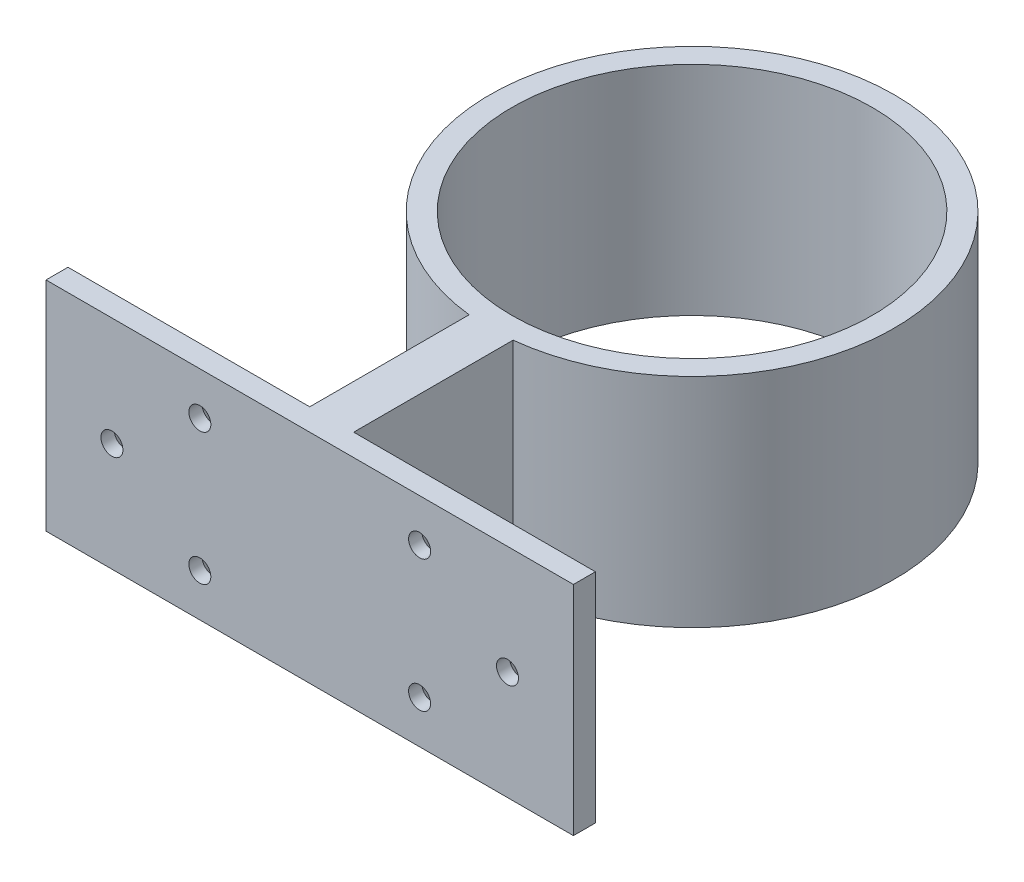
ISO-10303-21;
HEADER;
FILE_DESCRIPTION(('STEP AP214'),'2;1');
FILE_NAME('part.step','',(''),(''),'','','');
FILE_SCHEMA(('AUTOMOTIVE_DESIGN { 1 0 10303 214 1 1 1 1 }'));
ENDSEC;
DATA;
#1=APPLICATION_CONTEXT('core data for automotive mechanical design processes');
#2=APPLICATION_PROTOCOL_DEFINITION('international standard','automotive_design',2000,#1);
#3=PRODUCT_CONTEXT('',#1,'mechanical');
#4=PRODUCT('Part','Part','',(#3));
#5=PRODUCT_RELATED_PRODUCT_CATEGORY('part','',(#4));
#6=PRODUCT_DEFINITION_FORMATION('','',#4);
#7=PRODUCT_DEFINITION_CONTEXT('part definition',#1,'design');
#8=PRODUCT_DEFINITION('design','',#6,#7);
#9=PRODUCT_DEFINITION_SHAPE('','',#8);
#10=(LENGTH_UNIT() NAMED_UNIT(*) SI_UNIT(.MILLI.,.METRE.));
#11=(NAMED_UNIT(*) PLANE_ANGLE_UNIT() SI_UNIT($,.RADIAN.));
#12=(NAMED_UNIT(*) SI_UNIT($,.STERADIAN.) SOLID_ANGLE_UNIT());
#13=UNCERTAINTY_MEASURE_WITH_UNIT(LENGTH_MEASURE(1.E-05),#10,'distance_accuracy_value','');
#14=(GEOMETRIC_REPRESENTATION_CONTEXT(3) GLOBAL_UNCERTAINTY_ASSIGNED_CONTEXT((#13)) GLOBAL_UNIT_ASSIGNED_CONTEXT((#10,
#11,#12)) REPRESENTATION_CONTEXT('',''));
#15=CARTESIAN_POINT('',(0.,0.,0.));
#16=DIRECTION('',(0.,0.,1.));
#17=DIRECTION('',(1.,0.,0.));
#18=AXIS2_PLACEMENT_3D('',#15,#16,#17);
#19=CARTESIAN_POINT('',(60.,24.75,87.));
#20=DIRECTION('',(0.,0.,-1.));
#21=DIRECTION('',(-1.,0.,0.));
#22=AXIS2_PLACEMENT_3D('',#19,#20,#21);
#23=PLANE('',#22);
#24=CARTESIAN_POINT('',(-25.,15.,87.));
#25=DIRECTION('',(0.,0.,1.));
#26=DIRECTION('',(1.,0.,0.));
#27=AXIS2_PLACEMENT_3D('',#24,#25,#26);
#28=CIRCLE('',#27,2.5);
#29=CARTESIAN_POINT('',(-22.5,15.,87.));
#30=VERTEX_POINT('',#29);
#31=EDGE_CURVE('E303',#30,#30,#28,.T.);
#32=ORIENTED_EDGE('',*,*,#31,.F.);
#33=EDGE_LOOP('',(#32));
#34=FACE_BOUND('',#33,.T.);
#35=DIRECTION('',(1.,0.,0.));
#36=VECTOR('',#35,1.);
#37=CARTESIAN_POINT('',(60.,-24.75,87.));
#38=LINE('',#37,#36);
#39=CARTESIAN_POINT('',(-60.,-24.75,87.));
#40=VERTEX_POINT('',#39);
#41=CARTESIAN_POINT('',(60.,-24.75,87.));
#42=VERTEX_POINT('',#41);
#43=EDGE_CURVE('E92',#40,#42,#38,.T.);
#44=ORIENTED_EDGE('',*,*,#43,.T.);
#45=DIRECTION('',(0.,-1.,0.));
#46=VECTOR('',#45,1.);
#47=CARTESIAN_POINT('',(60.,24.75,87.));
#48=LINE('',#47,#46);
#49=CARTESIAN_POINT('',(60.,24.75,87.));
#50=VERTEX_POINT('',#49);
#51=EDGE_CURVE('E135',#50,#42,#48,.T.);
#52=ORIENTED_EDGE('',*,*,#51,.F.);
#53=DIRECTION('',(1.,0.,0.));
#54=VECTOR('',#53,1.);
#55=CARTESIAN_POINT('',(60.,24.75,87.));
#56=LINE('',#55,#54);
#57=CARTESIAN_POINT('',(-60.,24.75,87.));
#58=VERTEX_POINT('',#57);
#59=EDGE_CURVE('E57',#58,#50,#56,.T.);
#60=ORIENTED_EDGE('',*,*,#59,.F.);
#61=DIRECTION('',(0.,-1.,0.));
#62=VECTOR('',#61,1.);
#63=CARTESIAN_POINT('',(-60.,24.75,87.));
#64=LINE('',#63,#62);
#65=EDGE_CURVE('E131',#58,#40,#64,.T.);
#66=ORIENTED_EDGE('',*,*,#65,.T.);
#67=EDGE_LOOP('',(#44,#52,#60,#66));
#68=FACE_BOUND('',#67,.T.);
#69=CARTESIAN_POINT('',(45.,0.,87.));
#70=DIRECTION('',(0.,0.,-1.));
#71=DIRECTION('',(-1.,0.,0.));
#72=AXIS2_PLACEMENT_3D('',#69,#70,#71);
#73=CIRCLE('',#72,2.5);
#74=CARTESIAN_POINT('',(42.5,0.,87.));
#75=VERTEX_POINT('',#74);
#76=EDGE_CURVE('E316',#75,#75,#73,.T.);
#77=ORIENTED_EDGE('',*,*,#76,.T.);
#78=EDGE_LOOP('',(#77));
#79=FACE_BOUND('',#78,.T.);
#80=CARTESIAN_POINT('',(25.,-15.,87.));
#81=DIRECTION('',(0.,0.,-1.));
#82=DIRECTION('',(-1.,0.,0.));
#83=AXIS2_PLACEMENT_3D('',#80,#81,#82);
#84=CIRCLE('',#83,2.5);
#85=CARTESIAN_POINT('',(22.5,-15.,87.));
#86=VERTEX_POINT('',#85);
#87=EDGE_CURVE('E310',#86,#86,#84,.T.);
#88=ORIENTED_EDGE('',*,*,#87,.T.);
#89=EDGE_LOOP('',(#88));
#90=FACE_BOUND('',#89,.T.);
#91=CARTESIAN_POINT('',(25.,15.,87.));
#92=DIRECTION('',(0.,0.,-1.));
#93=DIRECTION('',(-1.,0.,0.));
#94=AXIS2_PLACEMENT_3D('',#91,#92,#93);
#95=CIRCLE('',#94,2.5);
#96=CARTESIAN_POINT('',(22.5,15.,87.));
#97=VERTEX_POINT('',#96);
#98=EDGE_CURVE('E304',#97,#97,#95,.T.);
#99=ORIENTED_EDGE('',*,*,#98,.T.);
#100=EDGE_LOOP('',(#99));
#101=FACE_BOUND('',#100,.T.);
#102=CARTESIAN_POINT('',(-25.,-15.,87.));
#103=DIRECTION('',(0.,0.,1.));
#104=DIRECTION('',(1.,0.,0.));
#105=AXIS2_PLACEMENT_3D('',#102,#103,#104);
#106=CIRCLE('',#105,2.5);
#107=CARTESIAN_POINT('',(-22.5,-15.,87.));
#108=VERTEX_POINT('',#107);
#109=EDGE_CURVE('E301',#108,#108,#106,.T.);
#110=ORIENTED_EDGE('',*,*,#109,.F.);
#111=EDGE_LOOP('',(#110));
#112=FACE_BOUND('',#111,.T.);
#113=CARTESIAN_POINT('',(-45.,0.,87.));
#114=DIRECTION('',(0.,0.,1.));
#115=DIRECTION('',(1.,0.,0.));
#116=AXIS2_PLACEMENT_3D('',#113,#114,#115);
#117=CIRCLE('',#116,2.5);
#118=CARTESIAN_POINT('',(-42.5,0.,87.));
#119=VERTEX_POINT('',#118);
#120=EDGE_CURVE('E307',#119,#119,#117,.T.);
#121=ORIENTED_EDGE('',*,*,#120,.F.);
#122=EDGE_LOOP('',(#121));
#123=FACE_BOUND('',#122,.T.);
#124=ADVANCED_FACE('F39',(#34,#68,#79,#90,#101,#112,#123),#23,.F.);
#125=CARTESIAN_POINT('',(0.,24.75,0.));
#126=DIRECTION('',(0.,1.,0.));
#127=DIRECTION('',(0.,0.,1.));
#128=AXIS2_PLACEMENT_3D('',#125,#126,#127);
#129=PLANE('',#128);
#130=DIRECTION('',(0.,0.,-1.));
#131=VECTOR('',#130,1.);
#132=CARTESIAN_POINT('',(60.,24.75,82.));
#133=LINE('',#132,#131);
#134=CARTESIAN_POINT('',(60.,24.75,82.));
#135=VERTEX_POINT('',#134);
#136=EDGE_CURVE('E154',#50,#135,#133,.T.);
#137=ORIENTED_EDGE('',*,*,#136,.T.);
#138=DIRECTION('',(-1.,0.,0.));
#139=VECTOR('',#138,1.);
#140=CARTESIAN_POINT('',(5.00000000000002,24.75,82.));
#141=LINE('',#140,#139);
#142=CARTESIAN_POINT('',(5.00000000000002,24.75,82.));
#143=VERTEX_POINT('',#142);
#144=EDGE_CURVE('E101',#135,#143,#141,.T.);
#145=ORIENTED_EDGE('',*,*,#144,.T.);
#146=DIRECTION('',(0.,0.,-1.));
#147=VECTOR('',#146,1.);
#148=CARTESIAN_POINT('',(5.,24.75,45.7274534606947));
#149=LINE('',#148,#147);
#150=CARTESIAN_POINT('',(5.,24.75,45.7274534606947));
#151=VERTEX_POINT('',#150);
#152=EDGE_CURVE('E326',#143,#151,#149,.T.);
#153=ORIENTED_EDGE('',*,*,#152,.T.);
#154=CARTESIAN_POINT('',(0.,24.75,0.));
#155=DIRECTION('',(0.,1.,0.));
#156=DIRECTION('',(0.,0.,1.));
#157=AXIS2_PLACEMENT_3D('',#154,#155,#156);
#158=CIRCLE('',#157,46.);
#159=CARTESIAN_POINT('',(-5.00000000000002,24.75,45.7274534606947));
#160=VERTEX_POINT('',#159);
#161=EDGE_CURVE('E328',#151,#160,#158,.T.);
#162=ORIENTED_EDGE('',*,*,#161,.T.);
#163=DIRECTION('',(0.,0.,1.));
#164=VECTOR('',#163,1.);
#165=CARTESIAN_POINT('',(-5.,24.75,45.7274534606947));
#166=LINE('',#165,#164);
#167=CARTESIAN_POINT('',(-5.,24.75,82.));
#168=VERTEX_POINT('',#167);
#169=EDGE_CURVE('E121',#160,#168,#166,.T.);
#170=ORIENTED_EDGE('',*,*,#169,.T.);
#171=DIRECTION('',(-1.,0.,0.));
#172=VECTOR('',#171,1.);
#173=CARTESIAN_POINT('',(-60.,24.75,82.));
#174=LINE('',#173,#172);
#175=CARTESIAN_POINT('',(-60.,24.75,82.));
#176=VERTEX_POINT('',#175);
#177=EDGE_CURVE('E114',#168,#176,#174,.T.);
#178=ORIENTED_EDGE('',*,*,#177,.T.);
#179=DIRECTION('',(0.,0.,1.));
#180=VECTOR('',#179,1.);
#181=CARTESIAN_POINT('',(-60.,24.75,87.));
#182=LINE('',#181,#180);
#183=EDGE_CURVE('E119',#176,#58,#182,.T.);
#184=ORIENTED_EDGE('',*,*,#183,.T.);
#185=ORIENTED_EDGE('',*,*,#59,.T.);
#186=EDGE_LOOP('',(#137,#145,#153,#162,#170,#178,#184,#185));
#187=FACE_BOUND('',#186,.T.);
#188=CARTESIAN_POINT('',(0.,24.75,0.));
#189=DIRECTION('',(0.,1.,0.));
#190=DIRECTION('',(0.,0.,1.));
#191=AXIS2_PLACEMENT_3D('',#188,#189,#190);
#192=CIRCLE('',#191,41.);
#193=CARTESIAN_POINT('',(0.,24.75,41.));
#194=VERTEX_POINT('',#193);
#195=EDGE_CURVE('E143',#194,#194,#192,.T.);
#196=ORIENTED_EDGE('',*,*,#195,.F.);
#197=EDGE_LOOP('',(#196));
#198=FACE_BOUND('',#197,.T.);
#199=ADVANCED_FACE('F116',(#187,#198),#129,.T.);
#200=CARTESIAN_POINT('',(0.,-24.75,0.));
#201=DIRECTION('',(0.,1.,0.));
#202=DIRECTION('',(0.,0.,1.));
#203=AXIS2_PLACEMENT_3D('',#200,#201,#202);
#204=PLANE('',#203);
#205=DIRECTION('',(0.,0.,-1.));
#206=VECTOR('',#205,1.);
#207=CARTESIAN_POINT('',(60.,-24.75,82.));
#208=LINE('',#207,#206);
#209=CARTESIAN_POINT('',(60.,-24.75,82.));
#210=VERTEX_POINT('',#209);
#211=EDGE_CURVE('E139',#42,#210,#208,.T.);
#212=ORIENTED_EDGE('',*,*,#211,.F.);
#213=ORIENTED_EDGE('',*,*,#43,.F.);
#214=DIRECTION('',(0.,0.,1.));
#215=VECTOR('',#214,1.);
#216=CARTESIAN_POINT('',(-60.,-24.75,87.));
#217=LINE('',#216,#215);
#218=CARTESIAN_POINT('',(-60.,-24.75,82.));
#219=VERTEX_POINT('',#218);
#220=EDGE_CURVE('E86',#219,#40,#217,.T.);
#221=ORIENTED_EDGE('',*,*,#220,.F.);
#222=DIRECTION('',(-1.,0.,0.));
#223=VECTOR('',#222,1.);
#224=CARTESIAN_POINT('',(-60.,-24.75,82.));
#225=LINE('',#224,#223);
#226=CARTESIAN_POINT('',(-5.,-24.75,82.));
#227=VERTEX_POINT('',#226);
#228=EDGE_CURVE('E129',#227,#219,#225,.T.);
#229=ORIENTED_EDGE('',*,*,#228,.F.);
#230=DIRECTION('',(0.,0.,1.));
#231=VECTOR('',#230,1.);
#232=CARTESIAN_POINT('',(-5.,-24.75,45.7274534606947));
#233=LINE('',#232,#231);
#234=CARTESIAN_POINT('',(-5.00000000000002,-24.75,45.7274534606947));
#235=VERTEX_POINT('',#234);
#236=EDGE_CURVE('E149',#235,#227,#233,.T.);
#237=ORIENTED_EDGE('',*,*,#236,.F.);
#238=CARTESIAN_POINT('',(0.,-24.75,0.));
#239=DIRECTION('',(0.,1.,0.));
#240=DIRECTION('',(0.,0.,1.));
#241=AXIS2_PLACEMENT_3D('',#238,#239,#240);
#242=CIRCLE('',#241,46.);
#243=CARTESIAN_POINT('',(5.,-24.75,45.7274534606947));
#244=VERTEX_POINT('',#243);
#245=EDGE_CURVE('E147',#244,#235,#242,.T.);
#246=ORIENTED_EDGE('',*,*,#245,.F.);
#247=DIRECTION('',(0.,0.,-1.));
#248=VECTOR('',#247,1.);
#249=CARTESIAN_POINT('',(5.,-24.75,45.7274534606947));
#250=LINE('',#249,#248);
#251=CARTESIAN_POINT('',(5.00000000000002,-24.75,82.));
#252=VERTEX_POINT('',#251);
#253=EDGE_CURVE('E145',#252,#244,#250,.T.);
#254=ORIENTED_EDGE('',*,*,#253,.F.);
#255=DIRECTION('',(-1.,0.,0.));
#256=VECTOR('',#255,1.);
#257=CARTESIAN_POINT('',(5.00000000000002,-24.75,82.));
#258=LINE('',#257,#256);
#259=EDGE_CURVE('E142',#210,#252,#258,.T.);
#260=ORIENTED_EDGE('',*,*,#259,.F.);
#261=EDGE_LOOP('',(#212,#213,#221,#229,#237,#246,#254,#260));
#262=FACE_BOUND('',#261,.T.);
#263=CARTESIAN_POINT('',(0.,-24.75,0.));
#264=DIRECTION('',(0.,1.,0.));
#265=DIRECTION('',(0.,0.,1.));
#266=AXIS2_PLACEMENT_3D('',#263,#264,#265);
#267=CIRCLE('',#266,41.);
#268=CARTESIAN_POINT('',(0.,-24.75,41.));
#269=VERTEX_POINT('',#268);
#270=EDGE_CURVE('E321',#269,#269,#267,.T.);
#271=ORIENTED_EDGE('',*,*,#270,.T.);
#272=EDGE_LOOP('',(#271));
#273=FACE_BOUND('',#272,.T.);
#274=ADVANCED_FACE('F230',(#262,#273),#204,.F.);
#275=CARTESIAN_POINT('',(60.,24.75,82.));
#276=DIRECTION('',(-1.,0.,0.));
#277=DIRECTION('',(0.,0.,1.));
#278=AXIS2_PLACEMENT_3D('',#275,#276,#277);
#279=PLANE('',#278);
#280=ORIENTED_EDGE('',*,*,#211,.T.);
#281=DIRECTION('',(0.,-1.,0.));
#282=VECTOR('',#281,1.);
#283=CARTESIAN_POINT('',(60.,24.75,82.));
#284=LINE('',#283,#282);
#285=EDGE_CURVE('E167',#135,#210,#284,.T.);
#286=ORIENTED_EDGE('',*,*,#285,.F.);
#287=ORIENTED_EDGE('',*,*,#136,.F.);
#288=ORIENTED_EDGE('',*,*,#51,.T.);
#289=EDGE_LOOP('',(#280,#286,#287,#288));
#290=FACE_BOUND('',#289,.T.);
#291=ADVANCED_FACE('F251',(#290),#279,.F.);
#292=CARTESIAN_POINT('',(5.00000000000002,24.75,82.));
#293=DIRECTION('',(0.,0.,1.));
#294=DIRECTION('',(1.,0.,0.));
#295=AXIS2_PLACEMENT_3D('',#292,#293,#294);
#296=PLANE('',#295);
#297=CARTESIAN_POINT('',(25.,-15.,82.));
#298=DIRECTION('',(0.,0.,1.));
#299=DIRECTION('',(1.,0.,0.));
#300=AXIS2_PLACEMENT_3D('',#297,#298,#299);
#301=CIRCLE('',#300,4.50000000000004);
#302=CARTESIAN_POINT('',(29.5,-15.,82.));
#303=VERTEX_POINT('',#302);
#304=EDGE_CURVE('E178',#303,#303,#301,.T.);
#305=ORIENTED_EDGE('',*,*,#304,.T.);
#306=EDGE_LOOP('',(#305));
#307=FACE_BOUND('',#306,.T.);
#308=CARTESIAN_POINT('',(45.,0.,82.));
#309=DIRECTION('',(0.,0.,1.));
#310=DIRECTION('',(1.,0.,0.));
#311=AXIS2_PLACEMENT_3D('',#308,#309,#310);
#312=CIRCLE('',#311,4.50000000000003);
#313=CARTESIAN_POINT('',(49.5000000000001,0.,82.));
#314=VERTEX_POINT('',#313);
#315=EDGE_CURVE('E175',#314,#314,#312,.T.);
#316=ORIENTED_EDGE('',*,*,#315,.T.);
#317=EDGE_LOOP('',(#316));
#318=FACE_BOUND('',#317,.T.);
#319=CARTESIAN_POINT('',(25.,15.,82.));
#320=DIRECTION('',(0.,0.,1.));
#321=DIRECTION('',(1.,0.,0.));
#322=AXIS2_PLACEMENT_3D('',#319,#320,#321);
#323=CIRCLE('',#322,4.50000000000004);
#324=CARTESIAN_POINT('',(29.5,15.,82.));
#325=VERTEX_POINT('',#324);
#326=EDGE_CURVE('E172',#325,#325,#323,.T.);
#327=ORIENTED_EDGE('',*,*,#326,.T.);
#328=EDGE_LOOP('',(#327));
#329=FACE_BOUND('',#328,.T.);
#330=ORIENTED_EDGE('',*,*,#259,.T.);
#331=DIRECTION('',(0.,-1.,0.));
#332=VECTOR('',#331,1.);
#333=CARTESIAN_POINT('',(5.00000000000002,24.75,82.));
#334=LINE('',#333,#332);
#335=EDGE_CURVE('E164',#143,#252,#334,.T.);
#336=ORIENTED_EDGE('',*,*,#335,.F.);
#337=ORIENTED_EDGE('',*,*,#144,.F.);
#338=ORIENTED_EDGE('',*,*,#285,.T.);
#339=EDGE_LOOP('',(#330,#336,#337,#338));
#340=FACE_BOUND('',#339,.T.);
#341=ADVANCED_FACE('F248',(#307,#318,#329,#340),#296,.F.);
#342=CARTESIAN_POINT('',(5.,24.75,45.7274534606947));
#343=DIRECTION('',(-1.,0.,0.));
#344=DIRECTION('',(0.,0.,1.));
#345=AXIS2_PLACEMENT_3D('',#342,#343,#344);
#346=PLANE('',#345);
#347=ORIENTED_EDGE('',*,*,#253,.T.);
#348=DIRECTION('',(0.,-1.,0.));
#349=VECTOR('',#348,1.);
#350=CARTESIAN_POINT('',(5.,24.75,45.7274534606947));
#351=LINE('',#350,#349);
#352=EDGE_CURVE('E161',#151,#244,#351,.T.);
#353=ORIENTED_EDGE('',*,*,#352,.F.);
#354=ORIENTED_EDGE('',*,*,#152,.F.);
#355=ORIENTED_EDGE('',*,*,#335,.T.);
#356=EDGE_LOOP('',(#347,#353,#354,#355));
#357=FACE_BOUND('',#356,.T.);
#358=ADVANCED_FACE('F244',(#357),#346,.F.);
#359=CARTESIAN_POINT('',(0.,24.75,0.));
#360=DIRECTION('',(0.,-1.,0.));
#361=DIRECTION('',(0.,0.,-1.));
#362=AXIS2_PLACEMENT_3D('',#359,#360,#361);
#363=CYLINDRICAL_SURFACE('',#362,46.);
#364=ORIENTED_EDGE('',*,*,#245,.T.);
#365=DIRECTION('',(0.,-1.,0.));
#366=VECTOR('',#365,1.);
#367=CARTESIAN_POINT('',(-5.00000000000002,24.75,45.7274534606947));
#368=LINE('',#367,#366);
#369=EDGE_CURVE('E158',#160,#235,#368,.T.);
#370=ORIENTED_EDGE('',*,*,#369,.F.);
#371=ORIENTED_EDGE('',*,*,#161,.F.);
#372=ORIENTED_EDGE('',*,*,#352,.T.);
#373=EDGE_LOOP('',(#364,#370,#371,#372));
#374=FACE_BOUND('',#373,.T.);
#375=ADVANCED_FACE('F240',(#374),#363,.T.);
#376=CARTESIAN_POINT('',(-5.,24.75,45.7274534606947));
#377=DIRECTION('',(1.,0.,0.));
#378=DIRECTION('',(0.,0.,-1.));
#379=AXIS2_PLACEMENT_3D('',#376,#377,#378);
#380=PLANE('',#379);
#381=ORIENTED_EDGE('',*,*,#236,.T.);
#382=DIRECTION('',(0.,-1.,0.));
#383=VECTOR('',#382,1.);
#384=CARTESIAN_POINT('',(-5.,24.75,82.));
#385=LINE('',#384,#383);
#386=EDGE_CURVE('E130',#168,#227,#385,.T.);
#387=ORIENTED_EDGE('',*,*,#386,.F.);
#388=ORIENTED_EDGE('',*,*,#169,.F.);
#389=ORIENTED_EDGE('',*,*,#369,.T.);
#390=EDGE_LOOP('',(#381,#387,#388,#389));
#391=FACE_BOUND('',#390,.T.);
#392=ADVANCED_FACE('F212',(#391),#380,.F.);
#393=CARTESIAN_POINT('',(-60.,24.75,82.));
#394=DIRECTION('',(0.,0.,1.));
#395=DIRECTION('',(1.,0.,0.));
#396=AXIS2_PLACEMENT_3D('',#393,#394,#395);
#397=PLANE('',#396);
#398=CARTESIAN_POINT('',(-25.,-15.,82.));
#399=DIRECTION('',(0.,0.,1.));
#400=DIRECTION('',(1.,0.,0.));
#401=AXIS2_PLACEMENT_3D('',#398,#399,#400);
#402=CIRCLE('',#401,4.49999999999998);
#403=CARTESIAN_POINT('',(-20.5,-15.,82.));
#404=VERTEX_POINT('',#403);
#405=EDGE_CURVE('E193',#404,#404,#402,.T.);
#406=ORIENTED_EDGE('',*,*,#405,.T.);
#407=EDGE_LOOP('',(#406));
#408=FACE_BOUND('',#407,.T.);
#409=CARTESIAN_POINT('',(-45.,0.,82.));
#410=DIRECTION('',(0.,0.,1.));
#411=DIRECTION('',(1.,0.,0.));
#412=AXIS2_PLACEMENT_3D('',#409,#410,#411);
#413=CIRCLE('',#412,4.49999999999998);
#414=CARTESIAN_POINT('',(-40.5,0.,82.));
#415=VERTEX_POINT('',#414);
#416=EDGE_CURVE('E190',#415,#415,#413,.T.);
#417=ORIENTED_EDGE('',*,*,#416,.T.);
#418=EDGE_LOOP('',(#417));
#419=FACE_BOUND('',#418,.T.);
#420=CARTESIAN_POINT('',(-25.,15.,82.));
#421=DIRECTION('',(0.,0.,1.));
#422=DIRECTION('',(1.,0.,0.));
#423=AXIS2_PLACEMENT_3D('',#420,#421,#422);
#424=CIRCLE('',#423,4.49999999999998);
#425=CARTESIAN_POINT('',(-20.5,15.,82.));
#426=VERTEX_POINT('',#425);
#427=EDGE_CURVE('E187',#426,#426,#424,.T.);
#428=ORIENTED_EDGE('',*,*,#427,.T.);
#429=EDGE_LOOP('',(#428));
#430=FACE_BOUND('',#429,.T.);
#431=ORIENTED_EDGE('',*,*,#228,.T.);
#432=DIRECTION('',(0.,-1.,0.));
#433=VECTOR('',#432,1.);
#434=CARTESIAN_POINT('',(-60.,24.75,82.));
#435=LINE('',#434,#433);
#436=EDGE_CURVE('E126',#176,#219,#435,.T.);
#437=ORIENTED_EDGE('',*,*,#436,.F.);
#438=ORIENTED_EDGE('',*,*,#177,.F.);
#439=ORIENTED_EDGE('',*,*,#386,.T.);
#440=EDGE_LOOP('',(#431,#437,#438,#439));
#441=FACE_BOUND('',#440,.T.);
#442=ADVANCED_FACE('F127',(#408,#419,#430,#441),#397,.F.);
#443=CARTESIAN_POINT('',(-60.,24.75,87.));
#444=DIRECTION('',(1.,0.,0.));
#445=DIRECTION('',(0.,0.,-1.));
#446=AXIS2_PLACEMENT_3D('',#443,#444,#445);
#447=PLANE('',#446);
#448=ORIENTED_EDGE('',*,*,#220,.T.);
#449=ORIENTED_EDGE('',*,*,#65,.F.);
#450=ORIENTED_EDGE('',*,*,#183,.F.);
#451=ORIENTED_EDGE('',*,*,#436,.T.);
#452=EDGE_LOOP('',(#448,#449,#450,#451));
#453=FACE_BOUND('',#452,.T.);
#454=ADVANCED_FACE('F133',(#453),#447,.F.);
#455=CARTESIAN_POINT('',(0.,24.75,0.));
#456=DIRECTION('',(0.,-1.,0.));
#457=DIRECTION('',(0.,0.,-1.));
#458=AXIS2_PLACEMENT_3D('',#455,#456,#457);
#459=CYLINDRICAL_SURFACE('',#458,41.);
#460=ORIENTED_EDGE('',*,*,#195,.T.);
#461=EDGE_LOOP('',(#460));
#462=FACE_BOUND('',#461,.T.);
#463=ORIENTED_EDGE('',*,*,#270,.F.);
#464=EDGE_LOOP('',(#463));
#465=FACE_BOUND('',#464,.T.);
#466=ADVANCED_FACE('F236',(#462,#465),#459,.F.);
#467=CARTESIAN_POINT('',(45.,0.,57.));
#468=DIRECTION('',(0.,0.,1.));
#469=DIRECTION('',(1.,0.,0.));
#470=AXIS2_PLACEMENT_3D('',#467,#468,#469);
#471=CYLINDRICAL_SURFACE('',#470,2.5);
#472=CARTESIAN_POINT('',(45.,0.,84.));
#473=DIRECTION('',(0.,0.,1.));
#474=DIRECTION('',(1.,0.,0.));
#475=AXIS2_PLACEMENT_3D('',#472,#473,#474);
#476=CIRCLE('',#475,2.5);
#477=CARTESIAN_POINT('',(47.5,0.,84.));
#478=VERTEX_POINT('',#477);
#479=EDGE_CURVE('E181',#478,#478,#476,.F.);
#480=ORIENTED_EDGE('',*,*,#479,.T.);
#481=EDGE_LOOP('',(#480));
#482=FACE_BOUND('',#481,.T.);
#483=ORIENTED_EDGE('',*,*,#76,.F.);
#484=EDGE_LOOP('',(#483));
#485=FACE_BOUND('',#484,.T.);
#486=ADVANCED_FACE('F364',(#482,#485),#471,.F.);
#487=CARTESIAN_POINT('',(25.,-15.,57.));
#488=DIRECTION('',(0.,0.,1.));
#489=DIRECTION('',(1.,0.,0.));
#490=AXIS2_PLACEMENT_3D('',#487,#488,#489);
#491=CYLINDRICAL_SURFACE('',#490,2.5);
#492=CARTESIAN_POINT('',(25.,-15.,84.));
#493=DIRECTION('',(0.,0.,1.));
#494=DIRECTION('',(1.,0.,0.));
#495=AXIS2_PLACEMENT_3D('',#492,#493,#494);
#496=CIRCLE('',#495,2.5);
#497=CARTESIAN_POINT('',(27.5,-15.,84.));
#498=VERTEX_POINT('',#497);
#499=EDGE_CURVE('E169',#498,#498,#496,.F.);
#500=ORIENTED_EDGE('',*,*,#499,.T.);
#501=EDGE_LOOP('',(#500));
#502=FACE_BOUND('',#501,.T.);
#503=ORIENTED_EDGE('',*,*,#87,.F.);
#504=EDGE_LOOP('',(#503));
#505=FACE_BOUND('',#504,.T.);
#506=ADVANCED_FACE('F360',(#502,#505),#491,.F.);
#507=CARTESIAN_POINT('',(25.,15.,57.));
#508=DIRECTION('',(0.,0.,1.));
#509=DIRECTION('',(1.,0.,0.));
#510=AXIS2_PLACEMENT_3D('',#507,#508,#509);
#511=CYLINDRICAL_SURFACE('',#510,2.5);
#512=CARTESIAN_POINT('',(25.,15.,84.));
#513=DIRECTION('',(0.,0.,1.));
#514=DIRECTION('',(1.,0.,0.));
#515=AXIS2_PLACEMENT_3D('',#512,#513,#514);
#516=CIRCLE('',#515,2.5);
#517=CARTESIAN_POINT('',(27.5,15.,84.));
#518=VERTEX_POINT('',#517);
#519=EDGE_CURVE('E184',#518,#518,#516,.F.);
#520=ORIENTED_EDGE('',*,*,#519,.T.);
#521=EDGE_LOOP('',(#520));
#522=FACE_BOUND('',#521,.T.);
#523=ORIENTED_EDGE('',*,*,#98,.F.);
#524=EDGE_LOOP('',(#523));
#525=FACE_BOUND('',#524,.T.);
#526=ADVANCED_FACE('F297',(#522,#525),#511,.F.);
#527=CARTESIAN_POINT('',(-25.,-15.,57.));
#528=DIRECTION('',(0.,0.,1.));
#529=DIRECTION('',(1.,0.,0.));
#530=AXIS2_PLACEMENT_3D('',#527,#528,#529);
#531=CYLINDRICAL_SURFACE('',#530,2.5);
#532=CARTESIAN_POINT('',(-25.,-15.,84.));
#533=DIRECTION('',(0.,0.,1.));
#534=DIRECTION('',(1.,0.,0.));
#535=AXIS2_PLACEMENT_3D('',#532,#533,#534);
#536=CIRCLE('',#535,2.5);
#537=CARTESIAN_POINT('',(-22.5,-15.,84.));
#538=VERTEX_POINT('',#537);
#539=EDGE_CURVE('E196',#538,#538,#536,.F.);
#540=ORIENTED_EDGE('',*,*,#539,.T.);
#541=EDGE_LOOP('',(#540));
#542=FACE_BOUND('',#541,.T.);
#543=ORIENTED_EDGE('',*,*,#109,.T.);
#544=EDGE_LOOP('',(#543));
#545=FACE_BOUND('',#544,.T.);
#546=ADVANCED_FACE('F293',(#542,#545),#531,.F.);
#547=CARTESIAN_POINT('',(-25.,15.,57.));
#548=DIRECTION('',(0.,0.,1.));
#549=DIRECTION('',(1.,0.,0.));
#550=AXIS2_PLACEMENT_3D('',#547,#548,#549);
#551=CYLINDRICAL_SURFACE('',#550,2.5);
#552=CARTESIAN_POINT('',(-25.,15.,84.));
#553=DIRECTION('',(0.,0.,1.));
#554=DIRECTION('',(1.,0.,0.));
#555=AXIS2_PLACEMENT_3D('',#552,#553,#554);
#556=CIRCLE('',#555,2.5);
#557=CARTESIAN_POINT('',(-22.5,15.,84.));
#558=VERTEX_POINT('',#557);
#559=EDGE_CURVE('E11',#558,#558,#556,.F.);
#560=ORIENTED_EDGE('',*,*,#559,.T.);
#561=EDGE_LOOP('',(#560));
#562=FACE_BOUND('',#561,.T.);
#563=ORIENTED_EDGE('',*,*,#31,.T.);
#564=EDGE_LOOP('',(#563));
#565=FACE_BOUND('',#564,.T.);
#566=ADVANCED_FACE('F296',(#562,#565),#551,.F.);
#567=CARTESIAN_POINT('',(-45.,0.,57.));
#568=DIRECTION('',(0.,0.,1.));
#569=DIRECTION('',(1.,0.,0.));
#570=AXIS2_PLACEMENT_3D('',#567,#568,#569);
#571=CYLINDRICAL_SURFACE('',#570,2.5);
#572=CARTESIAN_POINT('',(-45.,0.,84.));
#573=DIRECTION('',(0.,0.,1.));
#574=DIRECTION('',(1.,0.,0.));
#575=AXIS2_PLACEMENT_3D('',#572,#573,#574);
#576=CIRCLE('',#575,2.5);
#577=CARTESIAN_POINT('',(-42.5,0.,84.));
#578=VERTEX_POINT('',#577);
#579=EDGE_CURVE('E49',#578,#578,#576,.F.);
#580=ORIENTED_EDGE('',*,*,#579,.T.);
#581=EDGE_LOOP('',(#580));
#582=FACE_BOUND('',#581,.T.);
#583=ORIENTED_EDGE('',*,*,#120,.T.);
#584=EDGE_LOOP('',(#583));
#585=FACE_BOUND('',#584,.T.);
#586=ADVANCED_FACE('F201',(#582,#585),#571,.F.);
#587=CARTESIAN_POINT('',(25.,-15.,84.));
#588=DIRECTION('',(0.,0.,-1.));
#589=DIRECTION('',(-1.,0.,0.));
#590=AXIS2_PLACEMENT_3D('',#587,#588,#589);
#591=CONICAL_SURFACE('',#590,2.5,0.785398163397449);
#592=ORIENTED_EDGE('',*,*,#304,.F.);
#593=EDGE_LOOP('',(#592));
#594=FACE_BOUND('',#593,.T.);
#595=ORIENTED_EDGE('',*,*,#499,.F.);
#596=EDGE_LOOP('',(#595));
#597=FACE_BOUND('',#596,.T.);
#598=ADVANCED_FACE('F257',(#594,#597),#591,.F.);
#599=CARTESIAN_POINT('',(45.,0.,84.));
#600=DIRECTION('',(0.,0.,-1.));
#601=DIRECTION('',(-1.,0.,0.));
#602=AXIS2_PLACEMENT_3D('',#599,#600,#601);
#603=CONICAL_SURFACE('',#602,2.5,0.785398163397455);
#604=ORIENTED_EDGE('',*,*,#315,.F.);
#605=EDGE_LOOP('',(#604));
#606=FACE_BOUND('',#605,.T.);
#607=ORIENTED_EDGE('',*,*,#479,.F.);
#608=EDGE_LOOP('',(#607));
#609=FACE_BOUND('',#608,.T.);
#610=ADVANCED_FACE('F263',(#606,#609),#603,.F.);
#611=CARTESIAN_POINT('',(25.,15.,84.));
#612=DIRECTION('',(0.,0.,-1.));
#613=DIRECTION('',(-1.,0.,0.));
#614=AXIS2_PLACEMENT_3D('',#611,#612,#613);
#615=CONICAL_SURFACE('',#614,2.5,0.785398163397449);
#616=ORIENTED_EDGE('',*,*,#326,.F.);
#617=EDGE_LOOP('',(#616));
#618=FACE_BOUND('',#617,.T.);
#619=ORIENTED_EDGE('',*,*,#519,.F.);
#620=EDGE_LOOP('',(#619));
#621=FACE_BOUND('',#620,.T.);
#622=ADVANCED_FACE('F270',(#618,#621),#615,.F.);
#623=CARTESIAN_POINT('',(-25.,-15.,82.));
#624=DIRECTION('',(0.,0.,-1.));
#625=DIRECTION('',(-1.,0.,0.));
#626=AXIS2_PLACEMENT_3D('',#623,#624,#625);
#627=CONICAL_SURFACE('',#626,4.49999999999998,0.785398163397442);
#628=ORIENTED_EDGE('',*,*,#539,.F.);
#629=EDGE_LOOP('',(#628));
#630=FACE_BOUND('',#629,.T.);
#631=ORIENTED_EDGE('',*,*,#405,.F.);
#632=EDGE_LOOP('',(#631));
#633=FACE_BOUND('',#632,.T.);
#634=ADVANCED_FACE('F207',(#630,#633),#627,.F.);
#635=CARTESIAN_POINT('',(-45.,0.,82.));
#636=DIRECTION('',(0.,0.,-1.));
#637=DIRECTION('',(-1.,0.,0.));
#638=AXIS2_PLACEMENT_3D('',#635,#636,#637);
#639=CONICAL_SURFACE('',#638,4.49999999999998,0.785398163397445);
#640=ORIENTED_EDGE('',*,*,#579,.F.);
#641=EDGE_LOOP('',(#640));
#642=FACE_BOUND('',#641,.T.);
#643=ORIENTED_EDGE('',*,*,#416,.F.);
#644=EDGE_LOOP('',(#643));
#645=FACE_BOUND('',#644,.T.);
#646=ADVANCED_FACE('F204',(#642,#645),#639,.F.);
#647=CARTESIAN_POINT('',(-25.,15.,82.));
#648=DIRECTION('',(0.,0.,-1.));
#649=DIRECTION('',(-1.,0.,0.));
#650=AXIS2_PLACEMENT_3D('',#647,#648,#649);
#651=CONICAL_SURFACE('',#650,4.49999999999998,0.785398163397442);
#652=ORIENTED_EDGE('',*,*,#559,.F.);
#653=EDGE_LOOP('',(#652));
#654=FACE_BOUND('',#653,.T.);
#655=ORIENTED_EDGE('',*,*,#427,.F.);
#656=EDGE_LOOP('',(#655));
#657=FACE_BOUND('',#656,.T.);
#658=ADVANCED_FACE('F42',(#654,#657),#651,.F.);
#659=CLOSED_SHELL('',(#124,#199,#274,#291,#341,#358,#375,#392,#442,#454,#466,#486,#506,#526,
#546,#566,#586,#598,#610,#622,#634,#646,#658));
#660=MANIFOLD_SOLID_BREP('B2',#659);
#661=ADVANCED_BREP_SHAPE_REPRESENTATION('',(#18,#660),#14);
#662=SHAPE_DEFINITION_REPRESENTATION(#9,#661);
ENDSEC;
END-ISO-10303-21;
